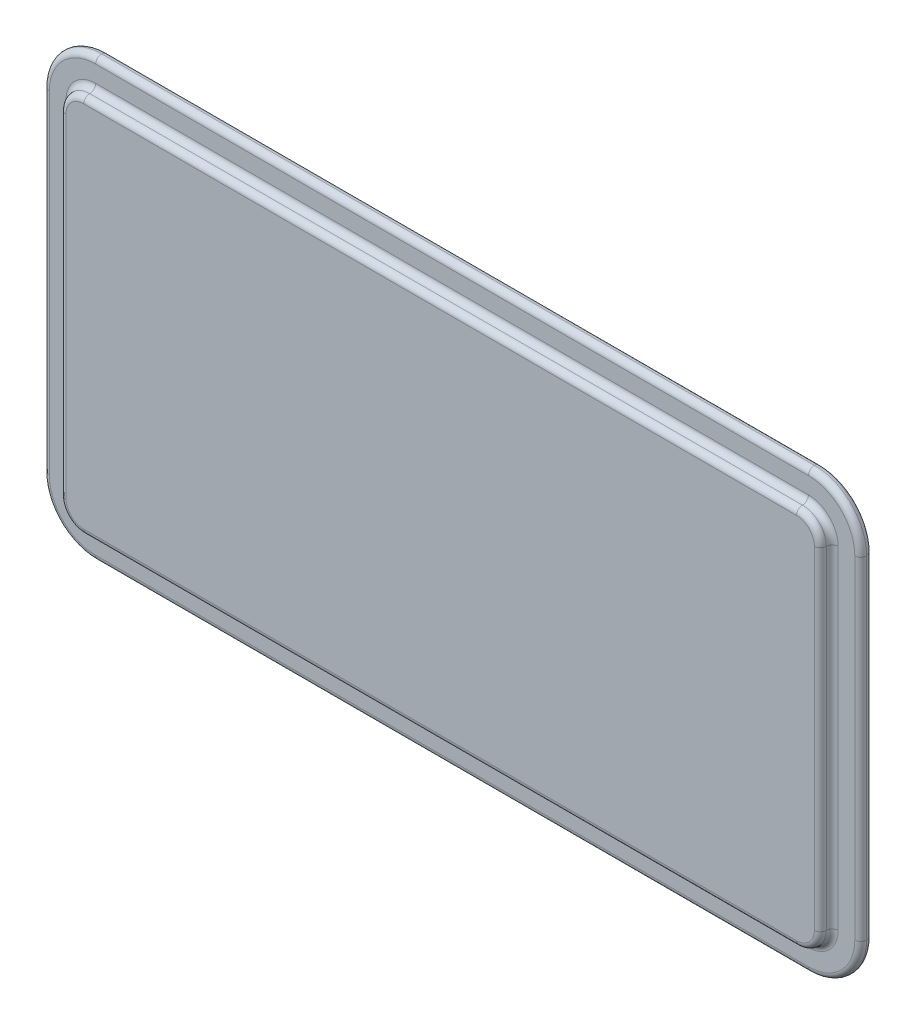
ISO-10303-21;
HEADER;
FILE_DESCRIPTION(('STEP AP214'),'2;1');
FILE_NAME('part.step','',(''),(''),'','','');
FILE_SCHEMA(('AUTOMOTIVE_DESIGN { 1 0 10303 214 1 1 1 1 }'));
ENDSEC;
DATA;
#1=APPLICATION_CONTEXT('core data for automotive mechanical design processes');
#2=APPLICATION_PROTOCOL_DEFINITION('international standard','automotive_design',2000,#1);
#3=PRODUCT_CONTEXT('',#1,'mechanical');
#4=PRODUCT('Part','Part','',(#3));
#5=PRODUCT_RELATED_PRODUCT_CATEGORY('part','',(#4));
#6=PRODUCT_DEFINITION_FORMATION('','',#4);
#7=PRODUCT_DEFINITION_CONTEXT('part definition',#1,'design');
#8=PRODUCT_DEFINITION('design','',#6,#7);
#9=PRODUCT_DEFINITION_SHAPE('','',#8);
#10=(LENGTH_UNIT() NAMED_UNIT(*) SI_UNIT(.MILLI.,.METRE.));
#11=(NAMED_UNIT(*) PLANE_ANGLE_UNIT() SI_UNIT($,.RADIAN.));
#12=(NAMED_UNIT(*) SI_UNIT($,.STERADIAN.) SOLID_ANGLE_UNIT());
#13=UNCERTAINTY_MEASURE_WITH_UNIT(LENGTH_MEASURE(1.E-05),#10,'distance_accuracy_value','');
#14=(GEOMETRIC_REPRESENTATION_CONTEXT(3) GLOBAL_UNCERTAINTY_ASSIGNED_CONTEXT((#13)) GLOBAL_UNIT_ASSIGNED_CONTEXT((#10,
#11,#12)) REPRESENTATION_CONTEXT('',''));
#15=CARTESIAN_POINT('',(0.,0.,0.));
#16=DIRECTION('',(0.,0.,1.));
#17=DIRECTION('',(1.,0.,0.));
#18=AXIS2_PLACEMENT_3D('',#15,#16,#17);
#19=CARTESIAN_POINT('',(150.,-70.,5.));
#20=DIRECTION('',(0.,0.,1.));
#21=DIRECTION('',(1.,0.,0.));
#22=AXIS2_PLACEMENT_3D('',#19,#20,#21);
#23=PLANE('',#22);
#24=DIRECTION('',(0.,1.,0.));
#25=VECTOR('',#24,1.);
#26=CARTESIAN_POINT('',(157.5,70.,5.));
#27=LINE('',#26,#25);
#28=CARTESIAN_POINT('',(157.5,-70.,5.));
#29=VERTEX_POINT('',#28);
#30=CARTESIAN_POINT('',(157.5,70.,5.));
#31=VERTEX_POINT('',#30);
#32=EDGE_CURVE('E46',#29,#31,#27,.T.);
#33=ORIENTED_EDGE('',*,*,#32,.T.);
#34=CARTESIAN_POINT('',(150.,70.,5.));
#35=DIRECTION('',(0.,0.,1.));
#36=DIRECTION('',(1.,0.,0.));
#37=AXIS2_PLACEMENT_3D('',#34,#35,#36);
#38=CIRCLE('',#37,7.50000000000001);
#39=CARTESIAN_POINT('',(150.,77.5,5.));
#40=VERTEX_POINT('',#39);
#41=EDGE_CURVE('E11',#31,#40,#38,.T.);
#42=ORIENTED_EDGE('',*,*,#41,.T.);
#43=DIRECTION('',(-1.,0.,0.));
#44=VECTOR('',#43,1.);
#45=CARTESIAN_POINT('',(-150.,77.5,5.));
#46=LINE('',#45,#44);
#47=CARTESIAN_POINT('',(-150.,77.5,5.));
#48=VERTEX_POINT('',#47);
#49=EDGE_CURVE('E303',#40,#48,#46,.T.);
#50=ORIENTED_EDGE('',*,*,#49,.T.);
#51=CARTESIAN_POINT('',(-150.,70.,5.));
#52=DIRECTION('',(0.,0.,1.));
#53=DIRECTION('',(1.,0.,0.));
#54=AXIS2_PLACEMENT_3D('',#51,#52,#53);
#55=CIRCLE('',#54,7.5);
#56=CARTESIAN_POINT('',(-157.5,70.,5.));
#57=VERTEX_POINT('',#56);
#58=EDGE_CURVE('E305',#48,#57,#55,.T.);
#59=ORIENTED_EDGE('',*,*,#58,.T.);
#60=DIRECTION('',(0.,-1.,0.));
#61=VECTOR('',#60,1.);
#62=CARTESIAN_POINT('',(-157.5,-70.,5.));
#63=LINE('',#62,#61);
#64=CARTESIAN_POINT('',(-157.5,-70.,5.));
#65=VERTEX_POINT('',#64);
#66=EDGE_CURVE('E307',#57,#65,#63,.T.);
#67=ORIENTED_EDGE('',*,*,#66,.T.);
#68=CARTESIAN_POINT('',(-150.,-70.,5.));
#69=DIRECTION('',(0.,0.,1.));
#70=DIRECTION('',(1.,0.,0.));
#71=AXIS2_PLACEMENT_3D('',#68,#69,#70);
#72=CIRCLE('',#71,7.5);
#73=CARTESIAN_POINT('',(-150.,-77.5,5.));
#74=VERTEX_POINT('',#73);
#75=EDGE_CURVE('E309',#65,#74,#72,.T.);
#76=ORIENTED_EDGE('',*,*,#75,.T.);
#77=DIRECTION('',(1.,0.,0.));
#78=VECTOR('',#77,1.);
#79=CARTESIAN_POINT('',(150.,-77.5,5.));
#80=LINE('',#79,#78);
#81=CARTESIAN_POINT('',(150.,-77.5,5.));
#82=VERTEX_POINT('',#81);
#83=EDGE_CURVE('E148',#74,#82,#80,.T.);
#84=ORIENTED_EDGE('',*,*,#83,.T.);
#85=CARTESIAN_POINT('',(150.,-70.,5.));
#86=DIRECTION('',(0.,0.,1.));
#87=DIRECTION('',(1.,0.,0.));
#88=AXIS2_PLACEMENT_3D('',#85,#86,#87);
#89=CIRCLE('',#88,7.50000000000002);
#90=EDGE_CURVE('E312',#82,#29,#89,.T.);
#91=ORIENTED_EDGE('',*,*,#90,.T.);
#92=EDGE_LOOP('',(#33,#42,#50,#59,#67,#76,#84,#91));
#93=FACE_BOUND('',#92,.T.);
#94=ADVANCED_FACE('F36',(#93),#23,.T.);
#95=CARTESIAN_POINT('',(-150.,70.,-5.));
#96=DIRECTION('',(0.,0.,-1.));
#97=DIRECTION('',(-1.,0.,0.));
#98=AXIS2_PLACEMENT_3D('',#95,#96,#97);
#99=PLANE('',#98);
#100=DIRECTION('',(-1.,0.,0.));
#101=VECTOR('',#100,1.);
#102=CARTESIAN_POINT('',(-150.,-89.5,-5.));
#103=LINE('',#102,#101);
#104=CARTESIAN_POINT('',(150.,-89.5,-5.));
#105=VERTEX_POINT('',#104);
#106=CARTESIAN_POINT('',(-150.,-89.5,-5.));
#107=VERTEX_POINT('',#106);
#108=EDGE_CURVE('E263',#105,#107,#103,.T.);
#109=ORIENTED_EDGE('',*,*,#108,.T.);
#110=CARTESIAN_POINT('',(-150.,-70.,-5.));
#111=DIRECTION('',(0.,0.,-1.));
#112=DIRECTION('',(-1.,0.,0.));
#113=AXIS2_PLACEMENT_3D('',#110,#111,#112);
#114=CIRCLE('',#113,19.5);
#115=CARTESIAN_POINT('',(-169.5,-70.,-5.));
#116=VERTEX_POINT('',#115);
#117=EDGE_CURVE('E244',#107,#116,#114,.T.);
#118=ORIENTED_EDGE('',*,*,#117,.T.);
#119=DIRECTION('',(0.,1.,0.));
#120=VECTOR('',#119,1.);
#121=CARTESIAN_POINT('',(-169.5,70.,-5.));
#122=LINE('',#121,#120);
#123=CARTESIAN_POINT('',(-169.5,70.,-5.));
#124=VERTEX_POINT('',#123);
#125=EDGE_CURVE('E252',#116,#124,#122,.T.);
#126=ORIENTED_EDGE('',*,*,#125,.T.);
#127=CARTESIAN_POINT('',(-150.,70.,-5.));
#128=DIRECTION('',(0.,0.,-1.));
#129=DIRECTION('',(-1.,0.,0.));
#130=AXIS2_PLACEMENT_3D('',#127,#128,#129);
#131=CIRCLE('',#130,19.5);
#132=CARTESIAN_POINT('',(-150.,89.5,-5.));
#133=VERTEX_POINT('',#132);
#134=EDGE_CURVE('E258',#124,#133,#131,.T.);
#135=ORIENTED_EDGE('',*,*,#134,.T.);
#136=DIRECTION('',(1.,0.,0.));
#137=VECTOR('',#136,1.);
#138=CARTESIAN_POINT('',(150.,89.5,-5.));
#139=LINE('',#138,#137);
#140=CARTESIAN_POINT('',(150.,89.5,-5.));
#141=VERTEX_POINT('',#140);
#142=EDGE_CURVE('E793',#133,#141,#139,.T.);
#143=ORIENTED_EDGE('',*,*,#142,.T.);
#144=CARTESIAN_POINT('',(150.,70.,-5.));
#145=DIRECTION('',(0.,0.,-1.));
#146=DIRECTION('',(-1.,0.,0.));
#147=AXIS2_PLACEMENT_3D('',#144,#145,#146);
#148=CIRCLE('',#147,19.5);
#149=CARTESIAN_POINT('',(169.5,70.,-5.));
#150=VERTEX_POINT('',#149);
#151=EDGE_CURVE('E786',#141,#150,#148,.T.);
#152=ORIENTED_EDGE('',*,*,#151,.T.);
#153=DIRECTION('',(0.,-1.,0.));
#154=VECTOR('',#153,1.);
#155=CARTESIAN_POINT('',(169.5,-70.,-5.));
#156=LINE('',#155,#154);
#157=CARTESIAN_POINT('',(169.5,-70.,-5.));
#158=VERTEX_POINT('',#157);
#159=EDGE_CURVE('E783',#150,#158,#156,.T.);
#160=ORIENTED_EDGE('',*,*,#159,.T.);
#161=CARTESIAN_POINT('',(150.,-70.,-5.));
#162=DIRECTION('',(0.,0.,-1.));
#163=DIRECTION('',(-1.,0.,0.));
#164=AXIS2_PLACEMENT_3D('',#161,#162,#163);
#165=CIRCLE('',#164,19.5);
#166=EDGE_CURVE('E269',#158,#105,#165,.T.);
#167=ORIENTED_EDGE('',*,*,#166,.T.);
#168=EDGE_LOOP('',(#109,#118,#126,#135,#143,#152,#160,#167));
#169=FACE_BOUND('',#168,.T.);
#170=ADVANCED_FACE('F261',(#169),#99,.T.);
#171=CARTESIAN_POINT('',(-150.,70.,0.));
#172=DIRECTION('',(0.,0.,-1.));
#173=DIRECTION('',(-1.,0.,0.));
#174=AXIS2_PLACEMENT_3D('',#171,#172,#173);
#175=PLANE('',#174);
#176=DIRECTION('',(0.,1.,0.));
#177=VECTOR('',#176,1.);
#178=CARTESIAN_POINT('',(-169.5,70.,0.));
#179=LINE('',#178,#177);
#180=CARTESIAN_POINT('',(-169.5,70.,0.));
#181=VERTEX_POINT('',#180);
#182=CARTESIAN_POINT('',(-169.5,-70.,0.));
#183=VERTEX_POINT('',#182);
#184=EDGE_CURVE('E286',#181,#183,#179,.F.);
#185=ORIENTED_EDGE('',*,*,#184,.T.);
#186=CARTESIAN_POINT('',(-150.,-70.,0.));
#187=DIRECTION('',(0.,0.,-1.));
#188=DIRECTION('',(-1.,0.,0.));
#189=AXIS2_PLACEMENT_3D('',#186,#187,#188);
#190=CIRCLE('',#189,19.5);
#191=CARTESIAN_POINT('',(-150.,-89.5,0.));
#192=VERTEX_POINT('',#191);
#193=EDGE_CURVE('E300',#183,#192,#190,.F.);
#194=ORIENTED_EDGE('',*,*,#193,.T.);
#195=DIRECTION('',(-1.,0.,0.));
#196=VECTOR('',#195,1.);
#197=CARTESIAN_POINT('',(-150.,-89.5,0.));
#198=LINE('',#197,#196);
#199=CARTESIAN_POINT('',(150.,-89.5,0.));
#200=VERTEX_POINT('',#199);
#201=EDGE_CURVE('E298',#192,#200,#198,.F.);
#202=ORIENTED_EDGE('',*,*,#201,.T.);
#203=CARTESIAN_POINT('',(150.,-70.,0.));
#204=DIRECTION('',(0.,0.,-1.));
#205=DIRECTION('',(-1.,0.,0.));
#206=AXIS2_PLACEMENT_3D('',#203,#204,#205);
#207=CIRCLE('',#206,19.5);
#208=CARTESIAN_POINT('',(169.5,-70.,0.));
#209=VERTEX_POINT('',#208);
#210=EDGE_CURVE('E296',#200,#209,#207,.F.);
#211=ORIENTED_EDGE('',*,*,#210,.T.);
#212=DIRECTION('',(0.,-1.,0.));
#213=VECTOR('',#212,1.);
#214=CARTESIAN_POINT('',(169.5,70.,0.));
#215=LINE('',#214,#213);
#216=CARTESIAN_POINT('',(169.5,70.,0.));
#217=VERTEX_POINT('',#216);
#218=EDGE_CURVE('E294',#209,#217,#215,.F.);
#219=ORIENTED_EDGE('',*,*,#218,.T.);
#220=CARTESIAN_POINT('',(150.,70.,0.));
#221=DIRECTION('',(0.,0.,-1.));
#222=DIRECTION('',(-1.,0.,0.));
#223=AXIS2_PLACEMENT_3D('',#220,#221,#222);
#224=CIRCLE('',#223,19.5);
#225=CARTESIAN_POINT('',(150.,89.5,0.));
#226=VERTEX_POINT('',#225);
#227=EDGE_CURVE('E292',#217,#226,#224,.F.);
#228=ORIENTED_EDGE('',*,*,#227,.T.);
#229=DIRECTION('',(1.,0.,0.));
#230=VECTOR('',#229,1.);
#231=CARTESIAN_POINT('',(-150.,89.5,0.));
#232=LINE('',#231,#230);
#233=CARTESIAN_POINT('',(-150.,89.5,0.));
#234=VERTEX_POINT('',#233);
#235=EDGE_CURVE('E290',#226,#234,#232,.F.);
#236=ORIENTED_EDGE('',*,*,#235,.T.);
#237=CARTESIAN_POINT('',(-150.,70.,0.));
#238=DIRECTION('',(0.,0.,-1.));
#239=DIRECTION('',(-1.,0.,0.));
#240=AXIS2_PLACEMENT_3D('',#237,#238,#239);
#241=CIRCLE('',#240,19.5);
#242=EDGE_CURVE('E288',#234,#181,#241,.F.);
#243=ORIENTED_EDGE('',*,*,#242,.T.);
#244=EDGE_LOOP('',(#185,#194,#202,#211,#219,#228,#236,#243));
#245=FACE_BOUND('',#244,.T.);
#246=DIRECTION('',(0.,-1.,0.));
#247=VECTOR('',#246,1.);
#248=CARTESIAN_POINT('',(-162.5,70.,0.));
#249=LINE('',#248,#247);
#250=CARTESIAN_POINT('',(-162.5,-70.,0.));
#251=VERTEX_POINT('',#250);
#252=CARTESIAN_POINT('',(-162.5,70.,0.));
#253=VERTEX_POINT('',#252);
#254=EDGE_CURVE('E265',#251,#253,#249,.F.);
#255=ORIENTED_EDGE('',*,*,#254,.T.);
#256=CARTESIAN_POINT('',(-150.,70.,0.));
#257=DIRECTION('',(0.,0.,-1.));
#258=DIRECTION('',(-1.,0.,0.));
#259=AXIS2_PLACEMENT_3D('',#256,#257,#258);
#260=CIRCLE('',#259,12.5);
#261=CARTESIAN_POINT('',(-150.,82.5,0.));
#262=VERTEX_POINT('',#261);
#263=EDGE_CURVE('E283',#253,#262,#260,.T.);
#264=ORIENTED_EDGE('',*,*,#263,.T.);
#265=DIRECTION('',(-1.,0.,0.));
#266=VECTOR('',#265,1.);
#267=CARTESIAN_POINT('',(150.,82.5,0.));
#268=LINE('',#267,#266);
#269=CARTESIAN_POINT('',(150.,82.5,0.));
#270=VERTEX_POINT('',#269);
#271=EDGE_CURVE('E281',#262,#270,#268,.F.);
#272=ORIENTED_EDGE('',*,*,#271,.T.);
#273=CARTESIAN_POINT('',(150.,70.,0.));
#274=DIRECTION('',(0.,0.,-1.));
#275=DIRECTION('',(-1.,0.,0.));
#276=AXIS2_PLACEMENT_3D('',#273,#274,#275);
#277=CIRCLE('',#276,12.5);
#278=CARTESIAN_POINT('',(162.5,70.,0.));
#279=VERTEX_POINT('',#278);
#280=EDGE_CURVE('E279',#270,#279,#277,.T.);
#281=ORIENTED_EDGE('',*,*,#280,.T.);
#282=DIRECTION('',(0.,1.,0.));
#283=VECTOR('',#282,1.);
#284=CARTESIAN_POINT('',(162.5,-70.,0.));
#285=LINE('',#284,#283);
#286=CARTESIAN_POINT('',(162.5,-70.,0.));
#287=VERTEX_POINT('',#286);
#288=EDGE_CURVE('E277',#279,#287,#285,.F.);
#289=ORIENTED_EDGE('',*,*,#288,.T.);
#290=CARTESIAN_POINT('',(150.,-70.,0.));
#291=DIRECTION('',(0.,0.,-1.));
#292=DIRECTION('',(-1.,0.,0.));
#293=AXIS2_PLACEMENT_3D('',#290,#291,#292);
#294=CIRCLE('',#293,12.5);
#295=CARTESIAN_POINT('',(150.,-82.5,0.));
#296=VERTEX_POINT('',#295);
#297=EDGE_CURVE('E129',#287,#296,#294,.T.);
#298=ORIENTED_EDGE('',*,*,#297,.T.);
#299=DIRECTION('',(1.,0.,0.));
#300=VECTOR('',#299,1.);
#301=CARTESIAN_POINT('',(-150.,-82.5,0.));
#302=LINE('',#301,#300);
#303=CARTESIAN_POINT('',(-150.,-82.5,0.));
#304=VERTEX_POINT('',#303);
#305=EDGE_CURVE('E274',#296,#304,#302,.F.);
#306=ORIENTED_EDGE('',*,*,#305,.T.);
#307=CARTESIAN_POINT('',(-150.,-70.,0.));
#308=DIRECTION('',(0.,0.,-1.));
#309=DIRECTION('',(-1.,0.,0.));
#310=AXIS2_PLACEMENT_3D('',#307,#308,#309);
#311=CIRCLE('',#310,12.5);
#312=EDGE_CURVE('E267',#304,#251,#311,.T.);
#313=ORIENTED_EDGE('',*,*,#312,.T.);
#314=EDGE_LOOP('',(#255,#264,#272,#281,#289,#298,#306,#313));
#315=FACE_BOUND('',#314,.T.);
#316=ADVANCED_FACE('F427',(#245,#315),#175,.F.);
#317=CARTESIAN_POINT('',(150.,70.,-2.5));
#318=DIRECTION('',(0.,0.,-1.));
#319=DIRECTION('',(-1.,0.,0.));
#320=AXIS2_PLACEMENT_3D('',#317,#318,#319);
#321=TOROIDAL_SURFACE('',#320,19.5,2.5);
#322=CARTESIAN_POINT('',(150.,89.5,-2.5));
#323=DIRECTION('',(-1.,0.,0.));
#324=DIRECTION('',(0.,0.,1.));
#325=AXIS2_PLACEMENT_3D('',#322,#323,#324);
#326=CIRCLE('',#325,2.5);
#327=CARTESIAN_POINT('',(150.,92.,-2.5));
#328=VERTEX_POINT('',#327);
#329=EDGE_CURVE('E366',#226,#328,#326,.T.);
#330=ORIENTED_EDGE('',*,*,#329,.F.);
#331=ORIENTED_EDGE('',*,*,#227,.F.);
#332=CARTESIAN_POINT('',(169.5,70.,-2.5));
#333=DIRECTION('',(0.,-1.,0.));
#334=DIRECTION('',(0.,0.,-1.));
#335=AXIS2_PLACEMENT_3D('',#332,#333,#334);
#336=CIRCLE('',#335,2.5);
#337=CARTESIAN_POINT('',(172.,70.,-2.5));
#338=VERTEX_POINT('',#337);
#339=EDGE_CURVE('E259',#338,#217,#336,.T.);
#340=ORIENTED_EDGE('',*,*,#339,.F.);
#341=CARTESIAN_POINT('',(150.,70.,-2.5));
#342=DIRECTION('',(0.,0.,-1.));
#343=DIRECTION('',(-1.,0.,0.));
#344=AXIS2_PLACEMENT_3D('',#341,#342,#343);
#345=CIRCLE('',#344,22.);
#346=EDGE_CURVE('E369',#328,#338,#345,.T.);
#347=ORIENTED_EDGE('',*,*,#346,.F.);
#348=EDGE_LOOP('',(#330,#331,#340,#347));
#349=FACE_BOUND('',#348,.T.);
#350=ADVANCED_FACE('F531',(#349),#321,.T.);
#351=CARTESIAN_POINT('',(169.5,70.,-2.5));
#352=DIRECTION('',(0.,-1.,0.));
#353=DIRECTION('',(0.,0.,-1.));
#354=AXIS2_PLACEMENT_3D('',#351,#352,#353);
#355=CYLINDRICAL_SURFACE('',#354,2.5);
#356=ORIENTED_EDGE('',*,*,#339,.T.);
#357=ORIENTED_EDGE('',*,*,#218,.F.);
#358=CARTESIAN_POINT('',(169.5,-70.,-2.5));
#359=DIRECTION('',(0.,-1.,0.));
#360=DIRECTION('',(0.,0.,-1.));
#361=AXIS2_PLACEMENT_3D('',#358,#359,#360);
#362=CIRCLE('',#361,2.5);
#363=CARTESIAN_POINT('',(172.,-70.,-2.5));
#364=VERTEX_POINT('',#363);
#365=EDGE_CURVE('E363',#364,#209,#362,.T.);
#366=ORIENTED_EDGE('',*,*,#365,.F.);
#367=DIRECTION('',(0.,-1.,0.));
#368=VECTOR('',#367,1.);
#369=CARTESIAN_POINT('',(172.,70.,-2.5));
#370=LINE('',#369,#368);
#371=EDGE_CURVE('E360',#338,#364,#370,.T.);
#372=ORIENTED_EDGE('',*,*,#371,.F.);
#373=EDGE_LOOP('',(#356,#357,#366,#372));
#374=FACE_BOUND('',#373,.T.);
#375=ADVANCED_FACE('F527',(#374),#355,.T.);
#376=CARTESIAN_POINT('',(150.,70.,-2.5));
#377=DIRECTION('',(0.,0.,-1.));
#378=DIRECTION('',(-1.,0.,0.));
#379=AXIS2_PLACEMENT_3D('',#376,#377,#378);
#380=TOROIDAL_SURFACE('',#379,19.5,2.5);
#381=CARTESIAN_POINT('',(150.,89.5,-2.5));
#382=DIRECTION('',(-1.,0.,0.));
#383=DIRECTION('',(0.,0.,1.));
#384=AXIS2_PLACEMENT_3D('',#381,#382,#383);
#385=CIRCLE('',#384,2.5);
#386=EDGE_CURVE('E354',#328,#141,#385,.T.);
#387=ORIENTED_EDGE('',*,*,#386,.F.);
#388=ORIENTED_EDGE('',*,*,#346,.T.);
#389=CARTESIAN_POINT('',(169.5,70.,-2.5));
#390=DIRECTION('',(0.,-1.,0.));
#391=DIRECTION('',(0.,0.,-1.));
#392=AXIS2_PLACEMENT_3D('',#389,#390,#391);
#393=CIRCLE('',#392,2.5);
#394=EDGE_CURVE('E357',#150,#338,#393,.T.);
#395=ORIENTED_EDGE('',*,*,#394,.F.);
#396=ORIENTED_EDGE('',*,*,#151,.F.);
#397=EDGE_LOOP('',(#387,#388,#395,#396));
#398=FACE_BOUND('',#397,.T.);
#399=ADVANCED_FACE('F523',(#398),#380,.T.);
#400=CARTESIAN_POINT('',(-150.,89.5,-2.5));
#401=DIRECTION('',(1.,0.,0.));
#402=DIRECTION('',(0.,0.,-1.));
#403=AXIS2_PLACEMENT_3D('',#400,#401,#402);
#404=CYLINDRICAL_SURFACE('',#403,2.5);
#405=ORIENTED_EDGE('',*,*,#235,.F.);
#406=ORIENTED_EDGE('',*,*,#329,.T.);
#407=DIRECTION('',(1.,0.,0.));
#408=VECTOR('',#407,1.);
#409=CARTESIAN_POINT('',(-150.,92.,-2.5));
#410=LINE('',#409,#408);
#411=CARTESIAN_POINT('',(-150.,92.,-2.5));
#412=VERTEX_POINT('',#411);
#413=EDGE_CURVE('E351',#412,#328,#410,.T.);
#414=ORIENTED_EDGE('',*,*,#413,.F.);
#415=CARTESIAN_POINT('',(-150.,89.5,-2.5));
#416=DIRECTION('',(-1.,0.,0.));
#417=DIRECTION('',(0.,0.,1.));
#418=AXIS2_PLACEMENT_3D('',#415,#416,#417);
#419=CIRCLE('',#418,2.5);
#420=EDGE_CURVE('E348',#234,#412,#419,.T.);
#421=ORIENTED_EDGE('',*,*,#420,.F.);
#422=EDGE_LOOP('',(#405,#406,#414,#421));
#423=FACE_BOUND('',#422,.T.);
#424=ADVANCED_FACE('F519',(#423),#404,.T.);
#425=CARTESIAN_POINT('',(150.,-70.,-2.5));
#426=DIRECTION('',(0.,0.,-1.));
#427=DIRECTION('',(-1.,0.,0.));
#428=AXIS2_PLACEMENT_3D('',#425,#426,#427);
#429=TOROIDAL_SURFACE('',#428,19.5,2.5);
#430=ORIENTED_EDGE('',*,*,#365,.T.);
#431=ORIENTED_EDGE('',*,*,#210,.F.);
#432=CARTESIAN_POINT('',(150.,-89.5,-2.5));
#433=DIRECTION('',(-1.,0.,0.));
#434=DIRECTION('',(0.,0.,1.));
#435=AXIS2_PLACEMENT_3D('',#432,#433,#434);
#436=CIRCLE('',#435,2.5);
#437=CARTESIAN_POINT('',(150.,-92.,-2.5));
#438=VERTEX_POINT('',#437);
#439=EDGE_CURVE('E345',#438,#200,#436,.T.);
#440=ORIENTED_EDGE('',*,*,#439,.F.);
#441=CARTESIAN_POINT('',(150.,-70.,-2.5));
#442=DIRECTION('',(0.,0.,-1.));
#443=DIRECTION('',(-1.,0.,0.));
#444=AXIS2_PLACEMENT_3D('',#441,#442,#443);
#445=CIRCLE('',#444,22.);
#446=EDGE_CURVE('E342',#364,#438,#445,.T.);
#447=ORIENTED_EDGE('',*,*,#446,.F.);
#448=EDGE_LOOP('',(#430,#431,#440,#447));
#449=FACE_BOUND('',#448,.T.);
#450=ADVANCED_FACE('F515',(#449),#429,.T.);
#451=CARTESIAN_POINT('',(169.5,70.,-2.5));
#452=DIRECTION('',(0.,1.,0.));
#453=DIRECTION('',(0.,0.,1.));
#454=AXIS2_PLACEMENT_3D('',#451,#452,#453);
#455=CYLINDRICAL_SURFACE('',#454,2.5);
#456=ORIENTED_EDGE('',*,*,#394,.T.);
#457=ORIENTED_EDGE('',*,*,#371,.T.);
#458=CARTESIAN_POINT('',(169.5,-70.,-2.5));
#459=DIRECTION('',(0.,-1.,0.));
#460=DIRECTION('',(0.,0.,-1.));
#461=AXIS2_PLACEMENT_3D('',#458,#459,#460);
#462=CIRCLE('',#461,2.5);
#463=EDGE_CURVE('E339',#158,#364,#462,.T.);
#464=ORIENTED_EDGE('',*,*,#463,.F.);
#465=ORIENTED_EDGE('',*,*,#159,.F.);
#466=EDGE_LOOP('',(#456,#457,#464,#465));
#467=FACE_BOUND('',#466,.T.);
#468=ADVANCED_FACE('F511',(#467),#455,.T.);
#469=CARTESIAN_POINT('',(-150.,89.5,-2.5));
#470=DIRECTION('',(-1.,0.,0.));
#471=DIRECTION('',(0.,0.,1.));
#472=AXIS2_PLACEMENT_3D('',#469,#470,#471);
#473=CYLINDRICAL_SURFACE('',#472,2.5);
#474=ORIENTED_EDGE('',*,*,#386,.T.);
#475=ORIENTED_EDGE('',*,*,#142,.F.);
#476=CARTESIAN_POINT('',(-150.,89.5,-2.5));
#477=DIRECTION('',(-1.,0.,0.));
#478=DIRECTION('',(0.,0.,1.));
#479=AXIS2_PLACEMENT_3D('',#476,#477,#478);
#480=CIRCLE('',#479,2.5);
#481=EDGE_CURVE('E336',#412,#133,#480,.T.);
#482=ORIENTED_EDGE('',*,*,#481,.F.);
#483=ORIENTED_EDGE('',*,*,#413,.T.);
#484=EDGE_LOOP('',(#474,#475,#482,#483));
#485=FACE_BOUND('',#484,.T.);
#486=ADVANCED_FACE('F507',(#485),#473,.T.);
#487=CARTESIAN_POINT('',(-150.,70.,-2.5));
#488=DIRECTION('',(0.,0.,-1.));
#489=DIRECTION('',(-1.,0.,0.));
#490=AXIS2_PLACEMENT_3D('',#487,#488,#489);
#491=TOROIDAL_SURFACE('',#490,19.5,2.5);
#492=ORIENTED_EDGE('',*,*,#242,.F.);
#493=ORIENTED_EDGE('',*,*,#420,.T.);
#494=CARTESIAN_POINT('',(-150.,70.,-2.5));
#495=DIRECTION('',(0.,0.,-1.));
#496=DIRECTION('',(-1.,0.,0.));
#497=AXIS2_PLACEMENT_3D('',#494,#495,#496);
#498=CIRCLE('',#497,22.);
#499=CARTESIAN_POINT('',(-172.,70.,-2.5));
#500=VERTEX_POINT('',#499);
#501=EDGE_CURVE('E333',#500,#412,#498,.T.);
#502=ORIENTED_EDGE('',*,*,#501,.F.);
#503=CARTESIAN_POINT('',(-169.5,70.,-2.5));
#504=DIRECTION('',(0.,-1.,0.));
#505=DIRECTION('',(0.,0.,-1.));
#506=AXIS2_PLACEMENT_3D('',#503,#504,#505);
#507=CIRCLE('',#506,2.5);
#508=EDGE_CURVE('E330',#181,#500,#507,.T.);
#509=ORIENTED_EDGE('',*,*,#508,.F.);
#510=EDGE_LOOP('',(#492,#493,#502,#509));
#511=FACE_BOUND('',#510,.T.);
#512=ADVANCED_FACE('F503',(#511),#491,.T.);
#513=CARTESIAN_POINT('',(150.,-89.5,-2.5));
#514=DIRECTION('',(-1.,0.,0.));
#515=DIRECTION('',(0.,-1.,0.));
#516=AXIS2_PLACEMENT_3D('',#513,#514,#515);
#517=CYLINDRICAL_SURFACE('',#516,2.5);
#518=ORIENTED_EDGE('',*,*,#439,.T.);
#519=ORIENTED_EDGE('',*,*,#201,.F.);
#520=CARTESIAN_POINT('',(-150.,-89.5,-2.5));
#521=DIRECTION('',(-1.,0.,0.));
#522=DIRECTION('',(0.,0.,1.));
#523=AXIS2_PLACEMENT_3D('',#520,#521,#522);
#524=CIRCLE('',#523,2.5);
#525=CARTESIAN_POINT('',(-150.,-92.,-2.5));
#526=VERTEX_POINT('',#525);
#527=EDGE_CURVE('E326',#526,#192,#524,.T.);
#528=ORIENTED_EDGE('',*,*,#527,.F.);
#529=DIRECTION('',(-1.,0.,0.));
#530=VECTOR('',#529,1.);
#531=CARTESIAN_POINT('',(150.,-92.,-2.5));
#532=LINE('',#531,#530);
#533=EDGE_CURVE('E323',#438,#526,#532,.T.);
#534=ORIENTED_EDGE('',*,*,#533,.F.);
#535=EDGE_LOOP('',(#518,#519,#528,#534));
#536=FACE_BOUND('',#535,.T.);
#537=ADVANCED_FACE('F499',(#536),#517,.T.);
#538=CARTESIAN_POINT('',(150.,-70.,-2.5));
#539=DIRECTION('',(0.,0.,-1.));
#540=DIRECTION('',(-1.,0.,0.));
#541=AXIS2_PLACEMENT_3D('',#538,#539,#540);
#542=TOROIDAL_SURFACE('',#541,19.5,2.5);
#543=ORIENTED_EDGE('',*,*,#463,.T.);
#544=ORIENTED_EDGE('',*,*,#446,.T.);
#545=CARTESIAN_POINT('',(150.,-89.5,-2.5));
#546=DIRECTION('',(-1.,0.,0.));
#547=DIRECTION('',(0.,0.,1.));
#548=AXIS2_PLACEMENT_3D('',#545,#546,#547);
#549=CIRCLE('',#548,2.5);
#550=EDGE_CURVE('E320',#105,#438,#549,.T.);
#551=ORIENTED_EDGE('',*,*,#550,.F.);
#552=ORIENTED_EDGE('',*,*,#166,.F.);
#553=EDGE_LOOP('',(#543,#544,#551,#552));
#554=FACE_BOUND('',#553,.T.);
#555=ADVANCED_FACE('F495',(#554),#542,.T.);
#556=CARTESIAN_POINT('',(-150.,70.,-2.5));
#557=DIRECTION('',(0.,0.,-1.));
#558=DIRECTION('',(-1.,0.,0.));
#559=AXIS2_PLACEMENT_3D('',#556,#557,#558);
#560=TOROIDAL_SURFACE('',#559,19.5,2.5);
#561=ORIENTED_EDGE('',*,*,#481,.T.);
#562=ORIENTED_EDGE('',*,*,#134,.F.);
#563=CARTESIAN_POINT('',(-169.5,70.,-2.5));
#564=DIRECTION('',(0.,-1.,0.));
#565=DIRECTION('',(0.,0.,-1.));
#566=AXIS2_PLACEMENT_3D('',#563,#564,#565);
#567=CIRCLE('',#566,2.5);
#568=EDGE_CURVE('E255',#500,#124,#567,.T.);
#569=ORIENTED_EDGE('',*,*,#568,.F.);
#570=ORIENTED_EDGE('',*,*,#501,.T.);
#571=EDGE_LOOP('',(#561,#562,#569,#570));
#572=FACE_BOUND('',#571,.T.);
#573=ADVANCED_FACE('F491',(#572),#560,.T.);
#574=CARTESIAN_POINT('',(-169.5,-70.,-2.5));
#575=DIRECTION('',(0.,1.,0.));
#576=DIRECTION('',(-1.,0.,0.));
#577=AXIS2_PLACEMENT_3D('',#574,#575,#576);
#578=CYLINDRICAL_SURFACE('',#577,2.5);
#579=CARTESIAN_POINT('',(-169.5,-70.,-2.5));
#580=DIRECTION('',(0.,-1.,0.));
#581=DIRECTION('',(0.,0.,-1.));
#582=AXIS2_PLACEMENT_3D('',#579,#580,#581);
#583=CIRCLE('',#582,2.5);
#584=CARTESIAN_POINT('',(-172.,-70.,-2.5));
#585=VERTEX_POINT('',#584);
#586=EDGE_CURVE('E328',#183,#585,#583,.T.);
#587=ORIENTED_EDGE('',*,*,#586,.F.);
#588=ORIENTED_EDGE('',*,*,#184,.F.);
#589=ORIENTED_EDGE('',*,*,#508,.T.);
#590=DIRECTION('',(0.,1.,0.));
#591=VECTOR('',#590,1.);
#592=CARTESIAN_POINT('',(-172.,-70.,-2.5));
#593=LINE('',#592,#591);
#594=EDGE_CURVE('E317',#585,#500,#593,.T.);
#595=ORIENTED_EDGE('',*,*,#594,.F.);
#596=EDGE_LOOP('',(#587,#588,#589,#595));
#597=FACE_BOUND('',#596,.T.);
#598=ADVANCED_FACE('F487',(#597),#578,.T.);
#599=CARTESIAN_POINT('',(-150.,-70.,-2.5));
#600=DIRECTION('',(0.,0.,-1.));
#601=DIRECTION('',(-1.,0.,0.));
#602=AXIS2_PLACEMENT_3D('',#599,#600,#601);
#603=TOROIDAL_SURFACE('',#602,19.5,2.5);
#604=ORIENTED_EDGE('',*,*,#193,.F.);
#605=ORIENTED_EDGE('',*,*,#586,.T.);
#606=CARTESIAN_POINT('',(-150.,-70.,-2.5));
#607=DIRECTION('',(0.,0.,-1.));
#608=DIRECTION('',(-1.,0.,0.));
#609=AXIS2_PLACEMENT_3D('',#606,#607,#608);
#610=CIRCLE('',#609,22.);
#611=EDGE_CURVE('E246',#526,#585,#610,.T.);
#612=ORIENTED_EDGE('',*,*,#611,.F.);
#613=ORIENTED_EDGE('',*,*,#527,.T.);
#614=EDGE_LOOP('',(#604,#605,#612,#613));
#615=FACE_BOUND('',#614,.T.);
#616=ADVANCED_FACE('F483',(#615),#603,.T.);
#617=CARTESIAN_POINT('',(-150.,-89.5,-2.5));
#618=DIRECTION('',(1.,0.,0.));
#619=DIRECTION('',(0.,1.,0.));
#620=AXIS2_PLACEMENT_3D('',#617,#618,#619);
#621=CYLINDRICAL_SURFACE('',#620,2.5);
#622=ORIENTED_EDGE('',*,*,#550,.T.);
#623=ORIENTED_EDGE('',*,*,#533,.T.);
#624=CARTESIAN_POINT('',(-150.,-89.5,-2.5));
#625=DIRECTION('',(-1.,0.,0.));
#626=DIRECTION('',(0.,0.,1.));
#627=AXIS2_PLACEMENT_3D('',#624,#625,#626);
#628=CIRCLE('',#627,2.5);
#629=EDGE_CURVE('E249',#107,#526,#628,.T.);
#630=ORIENTED_EDGE('',*,*,#629,.F.);
#631=ORIENTED_EDGE('',*,*,#108,.F.);
#632=EDGE_LOOP('',(#622,#623,#630,#631));
#633=FACE_BOUND('',#632,.T.);
#634=ADVANCED_FACE('F480',(#633),#621,.T.);
#635=CARTESIAN_POINT('',(-169.5,70.,-2.5));
#636=DIRECTION('',(0.,-1.,0.));
#637=DIRECTION('',(1.,0.,0.));
#638=AXIS2_PLACEMENT_3D('',#635,#636,#637);
#639=CYLINDRICAL_SURFACE('',#638,2.5);
#640=ORIENTED_EDGE('',*,*,#568,.T.);
#641=ORIENTED_EDGE('',*,*,#125,.F.);
#642=CARTESIAN_POINT('',(-169.5,-70.,-2.5));
#643=DIRECTION('',(0.,-1.,0.));
#644=DIRECTION('',(0.,0.,-1.));
#645=AXIS2_PLACEMENT_3D('',#642,#643,#644);
#646=CIRCLE('',#645,2.5);
#647=EDGE_CURVE('E116',#585,#116,#646,.T.);
#648=ORIENTED_EDGE('',*,*,#647,.F.);
#649=ORIENTED_EDGE('',*,*,#594,.T.);
#650=EDGE_LOOP('',(#640,#641,#648,#649));
#651=FACE_BOUND('',#650,.T.);
#652=ADVANCED_FACE('F253',(#651),#639,.T.);
#653=CARTESIAN_POINT('',(-150.,-70.,-2.5));
#654=DIRECTION('',(0.,0.,-1.));
#655=DIRECTION('',(-1.,0.,0.));
#656=AXIS2_PLACEMENT_3D('',#653,#654,#655);
#657=TOROIDAL_SURFACE('',#656,19.5,2.5);
#658=ORIENTED_EDGE('',*,*,#629,.T.);
#659=ORIENTED_EDGE('',*,*,#611,.T.);
#660=ORIENTED_EDGE('',*,*,#647,.T.);
#661=ORIENTED_EDGE('',*,*,#117,.F.);
#662=EDGE_LOOP('',(#658,#659,#660,#661));
#663=FACE_BOUND('',#662,.T.);
#664=ADVANCED_FACE('F242',(#663),#657,.T.);
#665=CARTESIAN_POINT('',(150.,-70.,2.5));
#666=DIRECTION('',(0.,0.,1.));
#667=DIRECTION('',(1.,0.,0.));
#668=AXIS2_PLACEMENT_3D('',#665,#666,#667);
#669=TOROIDAL_SURFACE('',#668,7.50000000000002,2.5);
#670=CARTESIAN_POINT('',(157.5,-70.,2.5));
#671=DIRECTION('',(0.,1.,0.));
#672=DIRECTION('',(0.,0.,1.));
#673=AXIS2_PLACEMENT_3D('',#670,#671,#672);
#674=CIRCLE('',#673,2.5);
#675=CARTESIAN_POINT('',(160.,-70.,2.5));
#676=VERTEX_POINT('',#675);
#677=EDGE_CURVE('E40',#29,#676,#674,.T.);
#678=ORIENTED_EDGE('',*,*,#677,.F.);
#679=ORIENTED_EDGE('',*,*,#90,.F.);
#680=CARTESIAN_POINT('',(150.,-77.5,2.5));
#681=DIRECTION('',(-1.,0.,0.));
#682=DIRECTION('',(0.,0.,1.));
#683=AXIS2_PLACEMENT_3D('',#680,#681,#682);
#684=CIRCLE('',#683,2.5);
#685=CARTESIAN_POINT('',(150.,-80.,2.5));
#686=VERTEX_POINT('',#685);
#687=EDGE_CURVE('E107',#686,#82,#684,.T.);
#688=ORIENTED_EDGE('',*,*,#687,.F.);
#689=CARTESIAN_POINT('',(150.,-70.,2.5));
#690=DIRECTION('',(0.,0.,1.));
#691=DIRECTION('',(1.,0.,0.));
#692=AXIS2_PLACEMENT_3D('',#689,#690,#691);
#693=CIRCLE('',#692,10.);
#694=EDGE_CURVE('E117',#676,#686,#693,.F.);
#695=ORIENTED_EDGE('',*,*,#694,.F.);
#696=EDGE_LOOP('',(#678,#679,#688,#695));
#697=FACE_BOUND('',#696,.T.);
#698=ADVANCED_FACE('F38',(#697),#669,.T.);
#699=CARTESIAN_POINT('',(157.5,-70.,2.5));
#700=DIRECTION('',(0.,-1.,0.));
#701=DIRECTION('',(0.,0.,-1.));
#702=AXIS2_PLACEMENT_3D('',#699,#700,#701);
#703=CYLINDRICAL_SURFACE('',#702,2.5);
#704=ORIENTED_EDGE('',*,*,#32,.F.);
#705=ORIENTED_EDGE('',*,*,#677,.T.);
#706=DIRECTION('',(0.,1.,0.));
#707=VECTOR('',#706,1.);
#708=CARTESIAN_POINT('',(160.,-70.,2.5));
#709=LINE('',#708,#707);
#710=CARTESIAN_POINT('',(160.,70.,2.5));
#711=VERTEX_POINT('',#710);
#712=EDGE_CURVE('E114',#711,#676,#709,.F.);
#713=ORIENTED_EDGE('',*,*,#712,.F.);
#714=CARTESIAN_POINT('',(157.5,70.,2.5));
#715=DIRECTION('',(0.,1.,0.));
#716=DIRECTION('',(0.,0.,1.));
#717=AXIS2_PLACEMENT_3D('',#714,#715,#716);
#718=CIRCLE('',#717,2.5);
#719=EDGE_CURVE('E138',#31,#711,#718,.T.);
#720=ORIENTED_EDGE('',*,*,#719,.F.);
#721=EDGE_LOOP('',(#704,#705,#713,#720));
#722=FACE_BOUND('',#721,.T.);
#723=ADVANCED_FACE('F112',(#722),#703,.T.);
#724=CARTESIAN_POINT('',(150.,-77.5,2.5));
#725=DIRECTION('',(-1.,0.,0.));
#726=DIRECTION('',(0.,0.,1.));
#727=AXIS2_PLACEMENT_3D('',#724,#725,#726);
#728=CYLINDRICAL_SURFACE('',#727,2.5);
#729=ORIENTED_EDGE('',*,*,#687,.T.);
#730=ORIENTED_EDGE('',*,*,#83,.F.);
#731=CARTESIAN_POINT('',(-150.,-77.5,2.5));
#732=DIRECTION('',(-1.,0.,0.));
#733=DIRECTION('',(0.,0.,1.));
#734=AXIS2_PLACEMENT_3D('',#731,#732,#733);
#735=CIRCLE('',#734,2.5);
#736=CARTESIAN_POINT('',(-150.,-80.,2.5));
#737=VERTEX_POINT('',#736);
#738=EDGE_CURVE('E140',#737,#74,#735,.T.);
#739=ORIENTED_EDGE('',*,*,#738,.F.);
#740=DIRECTION('',(1.,0.,0.));
#741=VECTOR('',#740,1.);
#742=CARTESIAN_POINT('',(-150.,-80.,2.5));
#743=LINE('',#742,#741);
#744=EDGE_CURVE('E151',#686,#737,#743,.F.);
#745=ORIENTED_EDGE('',*,*,#744,.F.);
#746=EDGE_LOOP('',(#729,#730,#739,#745));
#747=FACE_BOUND('',#746,.T.);
#748=ADVANCED_FACE('F145',(#747),#728,.T.);
#749=CARTESIAN_POINT('',(150.,-70.,2.5));
#750=DIRECTION('',(0.,0.,-1.));
#751=DIRECTION('',(-1.,0.,0.));
#752=AXIS2_PLACEMENT_3D('',#749,#750,#751);
#753=TOROIDAL_SURFACE('',#752,12.5,2.5);
#754=CARTESIAN_POINT('',(150.,-82.5,2.5));
#755=DIRECTION('',(1.,0.,0.));
#756=DIRECTION('',(0.,0.,-1.));
#757=AXIS2_PLACEMENT_3D('',#754,#755,#756);
#758=CIRCLE('',#757,2.5);
#759=EDGE_CURVE('E415',#296,#686,#758,.T.);
#760=ORIENTED_EDGE('',*,*,#759,.F.);
#761=ORIENTED_EDGE('',*,*,#297,.F.);
#762=CARTESIAN_POINT('',(162.5,-70.,2.5));
#763=DIRECTION('',(0.,-1.,0.));
#764=DIRECTION('',(0.,0.,-1.));
#765=AXIS2_PLACEMENT_3D('',#762,#763,#764);
#766=CIRCLE('',#765,2.5);
#767=EDGE_CURVE('E122',#676,#287,#766,.T.);
#768=ORIENTED_EDGE('',*,*,#767,.F.);
#769=ORIENTED_EDGE('',*,*,#694,.T.);
#770=EDGE_LOOP('',(#760,#761,#768,#769));
#771=FACE_BOUND('',#770,.T.);
#772=ADVANCED_FACE('F126',(#771),#753,.F.);
#773=CARTESIAN_POINT('',(162.5,70.,2.5));
#774=DIRECTION('',(0.,-1.,0.));
#775=DIRECTION('',(0.,0.,-1.));
#776=AXIS2_PLACEMENT_3D('',#773,#774,#775);
#777=CYLINDRICAL_SURFACE('',#776,2.5);
#778=ORIENTED_EDGE('',*,*,#767,.T.);
#779=ORIENTED_EDGE('',*,*,#288,.F.);
#780=CARTESIAN_POINT('',(162.5,70.,2.5));
#781=DIRECTION('',(0.,-1.,0.));
#782=DIRECTION('',(0.,0.,-1.));
#783=AXIS2_PLACEMENT_3D('',#780,#781,#782);
#784=CIRCLE('',#783,2.5);
#785=EDGE_CURVE('E136',#711,#279,#784,.T.);
#786=ORIENTED_EDGE('',*,*,#785,.F.);
#787=ORIENTED_EDGE('',*,*,#712,.T.);
#788=EDGE_LOOP('',(#778,#779,#786,#787));
#789=FACE_BOUND('',#788,.T.);
#790=ADVANCED_FACE('F134',(#789),#777,.F.);
#791=CARTESIAN_POINT('',(150.,70.,2.5));
#792=DIRECTION('',(0.,0.,1.));
#793=DIRECTION('',(1.,0.,0.));
#794=AXIS2_PLACEMENT_3D('',#791,#792,#793);
#795=TOROIDAL_SURFACE('',#794,7.50000000000001,2.5);
#796=ORIENTED_EDGE('',*,*,#41,.F.);
#797=ORIENTED_EDGE('',*,*,#719,.T.);
#798=CARTESIAN_POINT('',(150.,70.,2.5));
#799=DIRECTION('',(0.,0.,1.));
#800=DIRECTION('',(1.,0.,0.));
#801=AXIS2_PLACEMENT_3D('',#798,#799,#800);
#802=CIRCLE('',#801,10.);
#803=CARTESIAN_POINT('',(150.,80.,2.5));
#804=VERTEX_POINT('',#803);
#805=EDGE_CURVE('E412',#804,#711,#802,.F.);
#806=ORIENTED_EDGE('',*,*,#805,.F.);
#807=CARTESIAN_POINT('',(150.,77.5,2.5));
#808=DIRECTION('',(-1.,0.,0.));
#809=DIRECTION('',(0.,0.,1.));
#810=AXIS2_PLACEMENT_3D('',#807,#808,#809);
#811=CIRCLE('',#810,2.5);
#812=EDGE_CURVE('E409',#40,#804,#811,.T.);
#813=ORIENTED_EDGE('',*,*,#812,.F.);
#814=EDGE_LOOP('',(#796,#797,#806,#813));
#815=FACE_BOUND('',#814,.T.);
#816=ADVANCED_FACE('F436',(#815),#795,.T.);
#817=CARTESIAN_POINT('',(-150.,-70.,2.5));
#818=DIRECTION('',(0.,0.,1.));
#819=DIRECTION('',(1.,0.,0.));
#820=AXIS2_PLACEMENT_3D('',#817,#818,#819);
#821=TOROIDAL_SURFACE('',#820,7.5,2.5);
#822=ORIENTED_EDGE('',*,*,#738,.T.);
#823=ORIENTED_EDGE('',*,*,#75,.F.);
#824=CARTESIAN_POINT('',(-157.5,-70.,2.5));
#825=DIRECTION('',(0.,1.,0.));
#826=DIRECTION('',(0.,0.,1.));
#827=AXIS2_PLACEMENT_3D('',#824,#825,#826);
#828=CIRCLE('',#827,2.5);
#829=CARTESIAN_POINT('',(-160.,-70.,2.5));
#830=VERTEX_POINT('',#829);
#831=EDGE_CURVE('E406',#830,#65,#828,.T.);
#832=ORIENTED_EDGE('',*,*,#831,.F.);
#833=CARTESIAN_POINT('',(-150.,-70.,2.5));
#834=DIRECTION('',(0.,0.,1.));
#835=DIRECTION('',(1.,0.,0.));
#836=AXIS2_PLACEMENT_3D('',#833,#834,#835);
#837=CIRCLE('',#836,10.);
#838=EDGE_CURVE('E403',#737,#830,#837,.F.);
#839=ORIENTED_EDGE('',*,*,#838,.F.);
#840=EDGE_LOOP('',(#822,#823,#832,#839));
#841=FACE_BOUND('',#840,.T.);
#842=ADVANCED_FACE('F420',(#841),#821,.T.);
#843=CARTESIAN_POINT('',(-150.,-82.5,2.5));
#844=DIRECTION('',(-1.,0.,0.));
#845=DIRECTION('',(0.,0.,1.));
#846=AXIS2_PLACEMENT_3D('',#843,#844,#845);
#847=CYLINDRICAL_SURFACE('',#846,2.5);
#848=ORIENTED_EDGE('',*,*,#759,.T.);
#849=ORIENTED_EDGE('',*,*,#744,.T.);
#850=CARTESIAN_POINT('',(-150.,-82.5,2.5));
#851=DIRECTION('',(1.,0.,0.));
#852=DIRECTION('',(0.,0.,-1.));
#853=AXIS2_PLACEMENT_3D('',#850,#851,#852);
#854=CIRCLE('',#853,2.5);
#855=EDGE_CURVE('E400',#304,#737,#854,.T.);
#856=ORIENTED_EDGE('',*,*,#855,.F.);
#857=ORIENTED_EDGE('',*,*,#305,.F.);
#858=EDGE_LOOP('',(#848,#849,#856,#857));
#859=FACE_BOUND('',#858,.T.);
#860=ADVANCED_FACE('F423',(#859),#847,.F.);
#861=CARTESIAN_POINT('',(150.,70.,2.5));
#862=DIRECTION('',(0.,0.,-1.));
#863=DIRECTION('',(-1.,0.,0.));
#864=AXIS2_PLACEMENT_3D('',#861,#862,#863);
#865=TOROIDAL_SURFACE('',#864,12.5,2.5);
#866=ORIENTED_EDGE('',*,*,#785,.T.);
#867=ORIENTED_EDGE('',*,*,#280,.F.);
#868=CARTESIAN_POINT('',(150.,82.5,2.5));
#869=DIRECTION('',(1.,0.,0.));
#870=DIRECTION('',(0.,0.,-1.));
#871=AXIS2_PLACEMENT_3D('',#868,#869,#870);
#872=CIRCLE('',#871,2.5);
#873=EDGE_CURVE('E397',#804,#270,#872,.T.);
#874=ORIENTED_EDGE('',*,*,#873,.F.);
#875=ORIENTED_EDGE('',*,*,#805,.T.);
#876=EDGE_LOOP('',(#866,#867,#874,#875));
#877=FACE_BOUND('',#876,.T.);
#878=ADVANCED_FACE('F431',(#877),#865,.F.);
#879=CARTESIAN_POINT('',(150.,77.5,2.5));
#880=DIRECTION('',(1.,0.,0.));
#881=DIRECTION('',(0.,1.,0.));
#882=AXIS2_PLACEMENT_3D('',#879,#880,#881);
#883=CYLINDRICAL_SURFACE('',#882,2.5);
#884=ORIENTED_EDGE('',*,*,#49,.F.);
#885=ORIENTED_EDGE('',*,*,#812,.T.);
#886=DIRECTION('',(-1.,0.,0.));
#887=VECTOR('',#886,1.);
#888=CARTESIAN_POINT('',(150.,80.,2.5));
#889=LINE('',#888,#887);
#890=CARTESIAN_POINT('',(-150.,80.,2.5));
#891=VERTEX_POINT('',#890);
#892=EDGE_CURVE('E394',#891,#804,#889,.F.);
#893=ORIENTED_EDGE('',*,*,#892,.F.);
#894=CARTESIAN_POINT('',(-150.,77.5,2.5));
#895=DIRECTION('',(-1.,0.,0.));
#896=DIRECTION('',(0.,0.,1.));
#897=AXIS2_PLACEMENT_3D('',#894,#895,#896);
#898=CIRCLE('',#897,2.5);
#899=EDGE_CURVE('E391',#48,#891,#898,.T.);
#900=ORIENTED_EDGE('',*,*,#899,.F.);
#901=EDGE_LOOP('',(#884,#885,#893,#900));
#902=FACE_BOUND('',#901,.T.);
#903=ADVANCED_FACE('F438',(#902),#883,.T.);
#904=CARTESIAN_POINT('',(-157.5,-70.,2.5));
#905=DIRECTION('',(0.,1.,0.));
#906=DIRECTION('',(-1.,0.,0.));
#907=AXIS2_PLACEMENT_3D('',#904,#905,#906);
#908=CYLINDRICAL_SURFACE('',#907,2.5);
#909=ORIENTED_EDGE('',*,*,#831,.T.);
#910=ORIENTED_EDGE('',*,*,#66,.F.);
#911=CARTESIAN_POINT('',(-157.5,70.,2.5));
#912=DIRECTION('',(0.,1.,0.));
#913=DIRECTION('',(0.,0.,1.));
#914=AXIS2_PLACEMENT_3D('',#911,#912,#913);
#915=CIRCLE('',#914,2.5);
#916=CARTESIAN_POINT('',(-160.,70.,2.5));
#917=VERTEX_POINT('',#916);
#918=EDGE_CURVE('E388',#917,#57,#915,.T.);
#919=ORIENTED_EDGE('',*,*,#918,.F.);
#920=DIRECTION('',(0.,-1.,0.));
#921=VECTOR('',#920,1.);
#922=CARTESIAN_POINT('',(-160.,70.,2.5));
#923=LINE('',#922,#921);
#924=EDGE_CURVE('E385',#830,#917,#923,.F.);
#925=ORIENTED_EDGE('',*,*,#924,.F.);
#926=EDGE_LOOP('',(#909,#910,#919,#925));
#927=FACE_BOUND('',#926,.T.);
#928=ADVANCED_FACE('F444',(#927),#908,.T.);
#929=CARTESIAN_POINT('',(-150.,-70.,2.5));
#930=DIRECTION('',(0.,0.,-1.));
#931=DIRECTION('',(-1.,0.,0.));
#932=AXIS2_PLACEMENT_3D('',#929,#930,#931);
#933=TOROIDAL_SURFACE('',#932,12.5,2.5);
#934=ORIENTED_EDGE('',*,*,#855,.T.);
#935=ORIENTED_EDGE('',*,*,#838,.T.);
#936=CARTESIAN_POINT('',(-162.5,-70.,2.5));
#937=DIRECTION('',(0.,-1.,0.));
#938=DIRECTION('',(0.,0.,-1.));
#939=AXIS2_PLACEMENT_3D('',#936,#937,#938);
#940=CIRCLE('',#939,2.5);
#941=EDGE_CURVE('E382',#251,#830,#940,.T.);
#942=ORIENTED_EDGE('',*,*,#941,.F.);
#943=ORIENTED_EDGE('',*,*,#312,.F.);
#944=EDGE_LOOP('',(#934,#935,#942,#943));
#945=FACE_BOUND('',#944,.T.);
#946=ADVANCED_FACE('F457',(#945),#933,.F.);
#947=CARTESIAN_POINT('',(-150.,82.5,2.5));
#948=DIRECTION('',(1.,0.,0.));
#949=DIRECTION('',(0.,1.,0.));
#950=AXIS2_PLACEMENT_3D('',#947,#948,#949);
#951=CYLINDRICAL_SURFACE('',#950,2.5);
#952=ORIENTED_EDGE('',*,*,#873,.T.);
#953=ORIENTED_EDGE('',*,*,#271,.F.);
#954=CARTESIAN_POINT('',(-150.,82.5,2.5));
#955=DIRECTION('',(1.,0.,0.));
#956=DIRECTION('',(0.,0.,-1.));
#957=AXIS2_PLACEMENT_3D('',#954,#955,#956);
#958=CIRCLE('',#957,2.5);
#959=EDGE_CURVE('E380',#891,#262,#958,.T.);
#960=ORIENTED_EDGE('',*,*,#959,.F.);
#961=ORIENTED_EDGE('',*,*,#892,.T.);
#962=EDGE_LOOP('',(#952,#953,#960,#961));
#963=FACE_BOUND('',#962,.T.);
#964=ADVANCED_FACE('F459',(#963),#951,.F.);
#965=CARTESIAN_POINT('',(-150.,70.,2.5));
#966=DIRECTION('',(0.,0.,1.));
#967=DIRECTION('',(1.,0.,0.));
#968=AXIS2_PLACEMENT_3D('',#965,#966,#967);
#969=TOROIDAL_SURFACE('',#968,7.5,2.5);
#970=ORIENTED_EDGE('',*,*,#58,.F.);
#971=ORIENTED_EDGE('',*,*,#899,.T.);
#972=CARTESIAN_POINT('',(-150.,70.,2.5));
#973=DIRECTION('',(0.,0.,1.));
#974=DIRECTION('',(1.,0.,0.));
#975=AXIS2_PLACEMENT_3D('',#972,#973,#974);
#976=CIRCLE('',#975,10.);
#977=EDGE_CURVE('E377',#917,#891,#976,.F.);
#978=ORIENTED_EDGE('',*,*,#977,.F.);
#979=ORIENTED_EDGE('',*,*,#918,.T.);
#980=EDGE_LOOP('',(#970,#971,#978,#979));
#981=FACE_BOUND('',#980,.T.);
#982=ADVANCED_FACE('F447',(#981),#969,.T.);
#983=CARTESIAN_POINT('',(-162.5,70.,2.5));
#984=DIRECTION('',(0.,1.,0.));
#985=DIRECTION('',(-1.,0.,0.));
#986=AXIS2_PLACEMENT_3D('',#983,#984,#985);
#987=CYLINDRICAL_SURFACE('',#986,2.5);
#988=ORIENTED_EDGE('',*,*,#941,.T.);
#989=ORIENTED_EDGE('',*,*,#924,.T.);
#990=CARTESIAN_POINT('',(-162.5,70.,2.5));
#991=DIRECTION('',(0.,-1.,0.));
#992=DIRECTION('',(0.,0.,-1.));
#993=AXIS2_PLACEMENT_3D('',#990,#991,#992);
#994=CIRCLE('',#993,2.5);
#995=EDGE_CURVE('E374',#253,#917,#994,.T.);
#996=ORIENTED_EDGE('',*,*,#995,.F.);
#997=ORIENTED_EDGE('',*,*,#254,.F.);
#998=EDGE_LOOP('',(#988,#989,#996,#997));
#999=FACE_BOUND('',#998,.T.);
#1000=ADVANCED_FACE('F455',(#999),#987,.F.);
#1001=CARTESIAN_POINT('',(-150.,70.,2.5));
#1002=DIRECTION('',(0.,0.,-1.));
#1003=DIRECTION('',(-1.,0.,0.));
#1004=AXIS2_PLACEMENT_3D('',#1001,#1002,#1003);
#1005=TOROIDAL_SURFACE('',#1004,12.5,2.5);
#1006=ORIENTED_EDGE('',*,*,#959,.T.);
#1007=ORIENTED_EDGE('',*,*,#263,.F.);
#1008=ORIENTED_EDGE('',*,*,#995,.T.);
#1009=ORIENTED_EDGE('',*,*,#977,.T.);
#1010=EDGE_LOOP('',(#1006,#1007,#1008,#1009));
#1011=FACE_BOUND('',#1010,.T.);
#1012=ADVANCED_FACE('F452',(#1011),#1005,.F.);
#1013=CLOSED_SHELL('',(#94,#170,#316,#350,#375,#399,#424,#450,#468,#486,#512,#537,#555,#573,
#598,#616,#634,#652,#664,#698,#723,#748,#772,#790,#816,#842,#860,#878,#903,#928,#946,#964,#982,
#1000,#1012));
#1014=MANIFOLD_SOLID_BREP('B2',#1013);
#1015=ADVANCED_BREP_SHAPE_REPRESENTATION('',(#18,#1014),#14);
#1016=SHAPE_DEFINITION_REPRESENTATION(#9,#1015);
ENDSEC;
END-ISO-10303-21;
